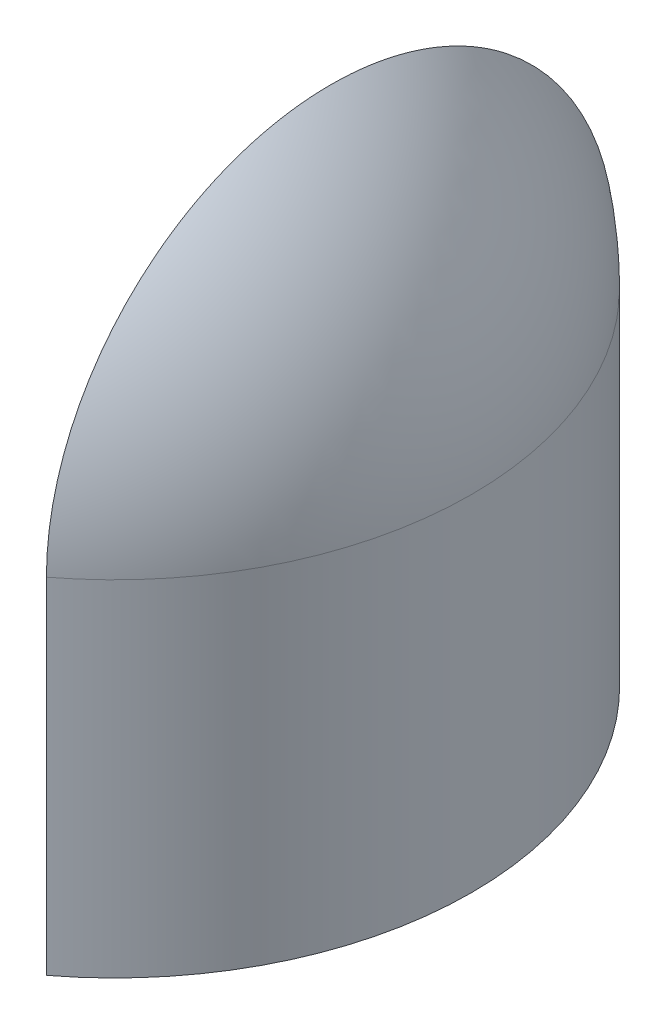
ISO-10303-21;
HEADER;
FILE_DESCRIPTION(('STEP AP214'),'2;1');
FILE_NAME('part.step','',(''),(''),'','','');
FILE_SCHEMA(('AUTOMOTIVE_DESIGN { 1 0 10303 214 1 1 1 1 }'));
ENDSEC;
DATA;
#1=APPLICATION_CONTEXT('core data for automotive mechanical design processes');
#2=APPLICATION_PROTOCOL_DEFINITION('international standard','automotive_design',2000,#1);
#3=PRODUCT_CONTEXT('',#1,'mechanical');
#4=PRODUCT('Part','Part','',(#3));
#5=PRODUCT_RELATED_PRODUCT_CATEGORY('part','',(#4));
#6=PRODUCT_DEFINITION_FORMATION('','',#4);
#7=PRODUCT_DEFINITION_CONTEXT('part definition',#1,'design');
#8=PRODUCT_DEFINITION('design','',#6,#7);
#9=PRODUCT_DEFINITION_SHAPE('','',#8);
#10=(LENGTH_UNIT() NAMED_UNIT(*) SI_UNIT(.MILLI.,.METRE.));
#11=(NAMED_UNIT(*) PLANE_ANGLE_UNIT() SI_UNIT($,.RADIAN.));
#12=(NAMED_UNIT(*) SI_UNIT($,.STERADIAN.) SOLID_ANGLE_UNIT());
#13=UNCERTAINTY_MEASURE_WITH_UNIT(LENGTH_MEASURE(1.E-05),#10,'distance_accuracy_value','');
#14=(GEOMETRIC_REPRESENTATION_CONTEXT(3) GLOBAL_UNCERTAINTY_ASSIGNED_CONTEXT((#13)) GLOBAL_UNIT_ASSIGNED_CONTEXT((#10,
#11,#12)) REPRESENTATION_CONTEXT('',''));
#15=CARTESIAN_POINT('',(0.,0.,0.));
#16=DIRECTION('',(0.,0.,1.));
#17=DIRECTION('',(1.,0.,0.));
#18=AXIS2_PLACEMENT_3D('',#15,#16,#17);
#19=CARTESIAN_POINT('',(57.499999999999,205.000000000001,0.));
#20=DIRECTION('',(-1.,0.,0.));
#21=DIRECTION('',(0.,0.,1.));
#22=AXIS2_PLACEMENT_3D('',#19,#20,#21);
#23=PLANE('',#22);
#24=CARTESIAN_POINT('',(57.499999999999,106.722527892982,0.));
#25=DIRECTION('',(-1.,0.,0.));
#26=DIRECTION('',(0.,0.,1.));
#27=AXIS2_PLACEMENT_3D('',#24,#25,#26);
#28=CIRCLE('',#27,75.6224173112716);
#29=CARTESIAN_POINT('',(57.499999999999,106.722527892982,75.6224173112716));
#30=VERTEX_POINT('',#29);
#31=CARTESIAN_POINT('',(57.499999999999,106.722527892982,-75.6224173112716));
#32=VERTEX_POINT('',#31);
#33=EDGE_CURVE('E283',#30,#32,#28,.T.);
#34=ORIENTED_EDGE('',*,*,#33,.T.);
#35=DIRECTION('',(0.,-1.,0.));
#36=VECTOR('',#35,1.);
#37=CARTESIAN_POINT('',(57.499999999999,25.,-75.6224173112716));
#38=LINE('',#37,#36);
#39=CARTESIAN_POINT('',(57.499999999999,15.0000000000009,-75.6224173112716));
#40=VERTEX_POINT('',#39);
#41=EDGE_CURVE('E289',#32,#40,#38,.T.);
#42=ORIENTED_EDGE('',*,*,#41,.T.);
#43=DIRECTION('',(0.,0.,1.));
#44=VECTOR('',#43,1.);
#45=CARTESIAN_POINT('',(57.499999999999,15.0000000000009,0.));
#46=LINE('',#45,#44);
#47=CARTESIAN_POINT('',(57.499999999999,15.0000000000009,-52.4285992260178));
#48=VERTEX_POINT('',#47);
#49=EDGE_CURVE('E44',#40,#48,#46,.T.);
#50=ORIENTED_EDGE('',*,*,#49,.T.);
#51=DIRECTION('',(0.,-1.,0.));
#52=VECTOR('',#51,1.);
#53=CARTESIAN_POINT('',(57.499999999999,207.501000000001,-52.4285992260178));
#54=LINE('',#53,#52);
#55=CARTESIAN_POINT('',(57.499999999999,45.2098005422494,-52.4285992260178));
#56=VERTEX_POINT('',#55);
#57=EDGE_CURVE('E371',#48,#56,#54,.F.);
#58=ORIENTED_EDGE('',*,*,#57,.T.);
#59=DIRECTION('',(0.,0.,1.));
#60=VECTOR('',#59,1.);
#61=CARTESIAN_POINT('',(57.499999999999,45.2098005422494,-95.));
#62=LINE('',#61,#60);
#63=CARTESIAN_POINT('',(57.4999999999997,45.2098005422512,-49.548037466709));
#64=VERTEX_POINT('',#63);
#65=EDGE_CURVE('E184',#64,#56,#62,.F.);
#66=ORIENTED_EDGE('',*,*,#65,.F.);
#67=DIRECTION('',(0.,1.,0.));
#68=VECTOR('',#67,1.);
#69=CARTESIAN_POINT('',(57.4999999999997,40.927673459077,-49.548037466709));
#70=LINE('',#69,#68);
#71=CARTESIAN_POINT('',(57.499999999999,140.927673459077,-49.548037466709));
#72=VERTEX_POINT('',#71);
#73=EDGE_CURVE('E178',#64,#72,#70,.T.);
#74=ORIENTED_EDGE('',*,*,#73,.T.);
#75=CARTESIAN_POINT('',(57.4999999999993,106.722527892983,0.));
#76=DIRECTION('',(1.,0.,0.));
#77=DIRECTION('',(0.,1.,0.));
#78=AXIS2_PLACEMENT_3D('',#75,#76,#77);
#79=CIRCLE('',#78,60.2079728939622);
#80=CARTESIAN_POINT('',(57.499999999999,140.927673459076,49.5480374667095));
#81=VERTEX_POINT('',#80);
#82=EDGE_CURVE('E39',#72,#81,#79,.T.);
#83=ORIENTED_EDGE('',*,*,#82,.T.);
#84=DIRECTION('',(0.,-1.,0.));
#85=VECTOR('',#84,1.);
#86=CARTESIAN_POINT('',(57.499999999999,140.927673459076,49.5480374667095));
#87=LINE('',#86,#85);
#88=CARTESIAN_POINT('',(57.4999999999997,45.2098005422512,49.5480374667095));
#89=VERTEX_POINT('',#88);
#90=EDGE_CURVE('E171',#81,#89,#87,.T.);
#91=ORIENTED_EDGE('',*,*,#90,.T.);
#92=DIRECTION('',(0.,0.,1.));
#93=VECTOR('',#92,1.);
#94=CARTESIAN_POINT('',(57.499999999999,45.2098005422494,-95.));
#95=LINE('',#94,#93);
#96=CARTESIAN_POINT('',(57.4999999999992,45.2098005422493,52.4285992260176));
#97=VERTEX_POINT('',#96);
#98=EDGE_CURVE('E304',#97,#89,#95,.F.);
#99=ORIENTED_EDGE('',*,*,#98,.F.);
#100=DIRECTION('',(0.,-1.,0.));
#101=VECTOR('',#100,1.);
#102=CARTESIAN_POINT('',(57.499999999999,207.501000000001,52.4285992260178));
#103=LINE('',#102,#101);
#104=CARTESIAN_POINT('',(57.499999999999,15.0000000000009,52.4285992260178));
#105=VERTEX_POINT('',#104);
#106=EDGE_CURVE('E373',#97,#105,#103,.T.);
#107=ORIENTED_EDGE('',*,*,#106,.T.);
#108=CARTESIAN_POINT('',(57.499999999999,15.0000000000009,75.6224173112716));
#109=VERTEX_POINT('',#108);
#110=EDGE_CURVE('E11',#105,#109,#46,.T.);
#111=ORIENTED_EDGE('',*,*,#110,.T.);
#112=DIRECTION('',(0.,-1.,0.));
#113=VECTOR('',#112,1.);
#114=CARTESIAN_POINT('',(57.499999999999,25.,75.6224173112716));
#115=LINE('',#114,#113);
#116=EDGE_CURVE('E189',#109,#30,#115,.F.);
#117=ORIENTED_EDGE('',*,*,#116,.T.);
#118=EDGE_LOOP('',(#34,#42,#50,#58,#66,#74,#83,#91,#99,#107,#111,#117));
#119=FACE_BOUND('',#118,.T.);
#120=ADVANCED_FACE('F34',(#119),#23,.T.);
#121=CARTESIAN_POINT('',(57.499999999999,15.0000000000009,0.));
#122=DIRECTION('',(0.,-1.,0.));
#123=DIRECTION('',(1.,0.,0.));
#124=AXIS2_PLACEMENT_3D('',#121,#122,#123);
#125=PLANE('',#124);
#126=ORIENTED_EDGE('',*,*,#110,.F.);
#127=CARTESIAN_POINT('',(0.,15.0000000000009,0.));
#128=DIRECTION('',(0.,-1.,0.));
#129=DIRECTION('',(1.,0.,0.));
#130=AXIS2_PLACEMENT_3D('',#127,#128,#129);
#131=CIRCLE('',#130,77.8139320225002);
#132=EDGE_CURVE('E288',#105,#48,#131,.F.);
#133=ORIENTED_EDGE('',*,*,#132,.T.);
#134=ORIENTED_EDGE('',*,*,#49,.F.);
#135=CARTESIAN_POINT('',(0.,15.0000000000009,0.));
#136=DIRECTION('',(0.,-1.,0.));
#137=DIRECTION('',(1.,0.,0.));
#138=AXIS2_PLACEMENT_3D('',#135,#136,#137);
#139=CIRCLE('',#138,95.);
#140=EDGE_CURVE('E186',#40,#109,#139,.T.);
#141=ORIENTED_EDGE('',*,*,#140,.T.);
#142=EDGE_LOOP('',(#126,#133,#134,#141));
#143=FACE_BOUND('',#142,.T.);
#144=ADVANCED_FACE('F250',(#143),#125,.T.);
#145=CARTESIAN_POINT('',(76.499999999999,147.111263946491,0.));
#146=DIRECTION('',(-1.,0.,0.));
#147=DIRECTION('',(0.,-1.,0.));
#148=AXIS2_PLACEMENT_3D('',#145,#146,#147);
#149=CYLINDRICAL_SURFACE('',#148,13.);
#150=DIRECTION('',(-1.,0.,0.));
#151=VECTOR('',#150,1.);
#152=CARTESIAN_POINT('',(76.499999999999,150.364833675964,-12.5862736350144));
#153=LINE('',#152,#151);
#154=CARTESIAN_POINT('',(76.499999999999,150.364833675964,-12.5862736350144));
#155=VERTEX_POINT('',#154);
#156=CARTESIAN_POINT('',(71.8466064746921,150.364833675964,-12.5862736350144));
#157=VERTEX_POINT('',#156);
#158=EDGE_CURVE('E351',#155,#157,#153,.T.);
#159=ORIENTED_EDGE('',*,*,#158,.F.);
#160=CARTESIAN_POINT('',(76.499999999999,147.111263946491,0.));
#161=DIRECTION('',(1.,0.,0.));
#162=DIRECTION('',(0.,1.,0.));
#163=AXIS2_PLACEMENT_3D('',#160,#161,#162);
#164=CIRCLE('',#163,13.);
#165=CARTESIAN_POINT('',(76.4999999999989,154.770031568916,10.5044408944835));
#166=VERTEX_POINT('',#165);
#167=EDGE_CURVE('E361',#155,#166,#164,.T.);
#168=ORIENTED_EDGE('',*,*,#167,.T.);
#169=DIRECTION('',(-1.,0.,0.));
#170=VECTOR('',#169,1.);
#171=CARTESIAN_POINT('',(76.4999999999989,154.770031568916,10.5044408944835));
#172=LINE('',#171,#170);
#173=CARTESIAN_POINT('',(69.3259988172218,154.770031568916,10.5044408944835));
#174=VERTEX_POINT('',#173);
#175=EDGE_CURVE('E354',#166,#174,#172,.T.);
#176=ORIENTED_EDGE('',*,*,#175,.T.);
#177=CARTESIAN_POINT('',(71.8467189050669,150.364633675964,-12.5863253336051));
#178=CARTESIAN_POINT('',(71.6328419163096,150.7451116213,-12.4879762810928));
#179=CARTESIAN_POINT('',(71.4201383773197,151.121770690636,-12.3722097157349));
#180=CARTESIAN_POINT('',(70.9985383745758,151.865085145619,-12.1060777194812));
#181=CARTESIAN_POINT('',(70.7896436054353,152.231736112823,-11.9556972747903));
#182=CARTESIAN_POINT('',(70.3759964601069,152.954628733967,-11.619592436234));
#183=CARTESIAN_POINT('',(70.1712789526628,153.310789191055,-11.4336489768622));
#184=CARTESIAN_POINT('',(69.869781771233,153.833109747973,-11.1291248160588));
#185=CARTESIAN_POINT('',(69.7702149064225,154.005225879106,-11.0233514786614));
#186=CARTESIAN_POINT('',(69.5731198858458,154.345220290091,-10.8032819124021));
#187=CARTESIAN_POINT('',(69.4755924182017,154.513097143391,-10.6889828644099));
#188=CARTESIAN_POINT('',(69.1859032603954,155.01072015572,-10.332730020338));
#189=CARTESIAN_POINT('',(68.9972034551853,155.333474165346,-10.0779926392922));
#190=CARTESIAN_POINT('',(68.6313101474404,155.956883232759,-9.53550261194367));
#191=CARTESIAN_POINT('',(68.4541154267531,156.257540630568,-9.24775346986488));
#192=CARTESIAN_POINT('',(68.1138197966279,156.832865827522,-8.64087866809644));
#193=CARTESIAN_POINT('',(67.9506901901449,157.107586659378,-8.32181987880415));
#194=CARTESIAN_POINT('',(67.7182319647807,157.497787091426,-7.82080457849305));
#195=CARTESIAN_POINT('',(67.6427879393398,157.624202626085,-7.65006867404525));
#196=CARTESIAN_POINT('',(67.4962355027534,157.869381747624,-7.30125756138245));
#197=CARTESIAN_POINT('',(67.4251290612779,157.988141859592,-7.1231790795622));
#198=CARTESIAN_POINT('',(67.2338480513691,158.307141438812,-6.61805846081697));
#199=CARTESIAN_POINT('',(67.1187674870859,158.498503330339,-6.28338845464036));
#200=CARTESIAN_POINT('',(66.9054262787973,158.85247478541,-5.59410245580553));
#201=CARTESIAN_POINT('',(66.8071617059502,159.015091065294,-5.2394911479722));
#202=CARTESIAN_POINT('',(66.6737464426229,159.235479818073,-4.69486615746536));
#203=CARTESIAN_POINT('',(66.6316096178607,159.305012459391,-4.51123169651767));
#204=CARTESIAN_POINT('',(66.5521890548256,159.435958929011,-4.14012244937118));
#205=CARTESIAN_POINT('',(66.5149040298708,159.497374909892,-3.9526486966669));
#206=CARTESIAN_POINT('',(66.4106170103248,159.669032721525,-3.38504336400061));
#207=CARTESIAN_POINT('',(66.3511495075768,159.766739799955,-2.99959132261416));
#208=CARTESIAN_POINT('',(66.2610488491341,159.914649320854,-2.27771331082883));
#209=CARTESIAN_POINT('',(66.2274211869947,159.969791250591,-1.94265111032112));
#210=CARTESIAN_POINT('',(66.1762081113399,160.053735608466,-1.26802675724969));
#211=CARTESIAN_POINT('',(66.1586207817907,160.08254118251,-0.928465147062252));
#212=CARTESIAN_POINT('',(66.1398012495565,160.113364055437,-0.247829585529989));
#213=CARTESIAN_POINT('',(66.1385620533854,160.115392809041,0.0932436566931948));
#214=CARTESIAN_POINT('',(66.1524415817188,160.092662036855,0.774159929029779));
#215=CARTESIAN_POINT('',(66.1675598210805,160.067903305551,1.11400299532885));
#216=CARTESIAN_POINT('',(66.2120434067109,159.995001523201,1.76273885486179));
#217=CARTESIAN_POINT('',(66.2401813651404,159.948872680824,2.07194542141671));
#218=CARTESIAN_POINT('',(66.3096812449334,159.83482848447,2.6847783401923));
#219=CARTESIAN_POINT('',(66.3510422463473,159.76691464611,2.98840507905747));
#220=CARTESIAN_POINT('',(66.4464094890974,159.61013162045,3.58808375569735));
#221=CARTESIAN_POINT('',(66.5004130837375,159.521266819155,3.88413726453932));
#222=CARTESIAN_POINT('',(66.6203715478334,159.323575905673,4.46700710747468));
#223=CARTESIAN_POINT('',(66.6863268482168,159.214749073737,4.75382310806359));
#224=CARTESIAN_POINT('',(66.831676917007,158.9745023037,5.32567391621218));
#225=CARTESIAN_POINT('',(66.9114331547172,158.842472614176,5.61036032599005));
#226=CARTESIAN_POINT('',(67.081917985275,158.559673015076,6.16696201913095));
#227=CARTESIAN_POINT('',(67.1726505803371,158.408896269362,6.43887259367443));
#228=CARTESIAN_POINT('',(67.3641641236419,158.089925963085,6.9688382683625));
#229=CARTESIAN_POINT('',(67.4649522142033,157.921720019416,7.22688331690237));
#230=CARTESIAN_POINT('',(67.6755876240161,157.56932744104,7.7280515014346));
#231=CARTESIAN_POINT('',(67.7854380073865,157.385135400049,7.97116954148056));
#232=CARTESIAN_POINT('',(68.0061940673468,157.014012426394,8.42713390512714));
#233=CARTESIAN_POINT('',(68.1166178173918,156.827949288188,8.64092244235938));
#234=CARTESIAN_POINT('',(68.3438270467667,156.44411622465,9.05413665530733));
#235=CARTESIAN_POINT('',(68.4606128181497,156.246345761847,9.2535616706781));
#236=CARTESIAN_POINT('',(68.6994078582807,155.840870472189,9.6369891785877));
#237=CARTESIAN_POINT('',(68.8213979958806,155.633201748159,9.82104185193251));
#238=CARTESIAN_POINT('',(69.0702703790164,155.208364366268,10.1741467840018));
#239=CARTESIAN_POINT('',(69.1971513879316,154.991198107945,10.3432027992929));
#240=CARTESIAN_POINT('',(69.3261586329737,154.769757249874,10.5046408944831));
#241=B_SPLINE_CURVE_WITH_KNOTS('',3,(#177,#178,#179,#180,#181,#182,#183,#184,#185,#186,#187,
#188,#189,#190,#191,#192,#193,#194,#195,#196,#197,#198,#199,#200,#201,#202,#203,#204,#205,#206,
#207,#208,#209,#210,#211,#212,#213,#214,#215,#216,#217,#218,#219,#220,#221,#222,#223,#224,#225,
#226,#227,#228,#229,#230,#231,#232,#233,#234,#235,#236,#237,#238,#239,#240),.UNSPECIFIED.,.F.,
.F.,(4,2,2,2,2,2,2,2,2,2,2,2,2,2,2,2,2,2,2,2,2,2,2,2,2,2,2,2,2,2,2,4),(0.,1.34190340274917,
2.68438995758226,4.03542921692799,4.71091605575903,5.3866272512467,6.7418550936305,
8.09693921040529,9.44918968079764,10.1252625379055,10.801640144585,12.0067488816307,
13.2115756748556,13.8138292778584,14.4159228381975,15.6196591327966,16.6420247466658,
17.6642682219474,18.6860743826282,19.7078502385389,20.648444511699,21.5889733603635,
22.5293054873967,23.4696715255483,24.4400216984434,25.4107267542389,26.3821262684639,
27.353855586643,28.2657206100768,29.1776275286403,30.0864307492203,30.9950056737624),.UNSPECIFIED.);
#242=EDGE_CURVE('E255',#157,#174,#241,.T.);
#243=ORIENTED_EDGE('',*,*,#242,.F.);
#244=EDGE_LOOP('',(#159,#168,#176,#243));
#245=FACE_BOUND('',#244,.T.);
#246=ADVANCED_FACE('F245',(#245),#149,.F.);
#247=CARTESIAN_POINT('',(76.4999999999999,12.4682327961274,-48.2327421157007));
#248=DIRECTION('',(0.,0.250274594574833,-0.968174895001106));
#249=DIRECTION('',(0.,0.968174895001106,0.250274594574833));
#250=AXIS2_PLACEMENT_3D('',#247,#248,#249);
#251=PLANE('',#250);
#252=DIRECTION('',(-1.,0.,0.));
#253=VECTOR('',#252,1.);
#254=CARTESIAN_POINT('',(76.4999999999996,53.6535697294732,-37.5862736350144));
#255=LINE('',#254,#253);
#256=CARTESIAN_POINT('',(76.4999999999996,53.6535697294732,-37.5862736350144));
#257=VERTEX_POINT('',#256);
#258=CARTESIAN_POINT('',(68.1342795590891,53.6535697294732,-37.5862736350144));
#259=VERTEX_POINT('',#258);
#260=EDGE_CURVE('E348',#257,#259,#255,.T.);
#261=ORIENTED_EDGE('',*,*,#260,.F.);
#262=DIRECTION('',(0.,-0.968174895001106,-0.250274594574833));
#263=VECTOR('',#262,1.);
#264=CARTESIAN_POINT('',(76.4999999999999,12.4682327961274,-48.2327421157007));
#265=LINE('',#264,#263);
#266=EDGE_CURVE('E363',#155,#257,#265,.T.);
#267=ORIENTED_EDGE('',*,*,#266,.F.);
#268=ORIENTED_EDGE('',*,*,#158,.T.);
#269=CARTESIAN_POINT('',(0.,112.505941935101,-22.3728512775654));
#270=DIRECTION('',(0.,0.250274594574833,-0.968174895001106));
#271=DIRECTION('',(0.,0.968174895001106,0.250274594574833));
#272=AXIS2_PLACEMENT_3D('',#269,#270,#271);
#273=CIRCLE('',#272,81.7985797415174);
#274=CARTESIAN_POINT('',(76.349417549936,140.927673459077,-15.0257930435573));
#275=VERTEX_POINT('',#274);
#276=EDGE_CURVE('E264',#157,#275,#273,.T.);
#277=ORIENTED_EDGE('',*,*,#276,.T.);
#278=CARTESIAN_POINT('',(0.,199.054210940709,0.));
#279=DIRECTION('',(0.,0.250274594574833,-0.968174895001106));
#280=DIRECTION('',(0.,-0.968174895001106,-0.250274594574833));
#281=AXIS2_PLACEMENT_3D('',#278,#279,#280);
#282=ELLIPSE('',#281,310.914226650494,77.8139320225002);
#283=EDGE_CURVE('E232',#259,#275,#282,.F.);
#284=ORIENTED_EDGE('',*,*,#283,.F.);
#285=EDGE_LOOP('',(#261,#267,#268,#277,#284));
#286=FACE_BOUND('',#285,.T.);
#287=ADVANCED_FACE('F241',(#286),#251,.F.);
#288=CARTESIAN_POINT('',(76.4999999999996,50.4000000000004,-25.));
#289=DIRECTION('',(-1.,0.,0.));
#290=DIRECTION('',(0.,-1.,0.));
#291=AXIS2_PLACEMENT_3D('',#288,#289,#290);
#292=CYLINDRICAL_SURFACE('',#291,13.);
#293=CARTESIAN_POINT('',(68.1342795590891,53.6535697294732,-37.5862736350144));
#294=CARTESIAN_POINT('',(68.1121382608706,53.4983096421865,-37.626409056009));
#295=CARTESIAN_POINT('',(68.0915111559926,53.3421209990942,-37.6637181022397));
#296=CARTESIAN_POINT('',(68.0533687001341,53.0281009758368,-37.7325931879928));
#297=CARTESIAN_POINT('',(68.035853453362,52.8702695408459,-37.7641590351904));
#298=CARTESIAN_POINT('',(67.9881071899536,52.3946936951342,-37.8500944340545));
#299=CARTESIAN_POINT('',(67.9626692666225,52.0748231910066,-37.8957133796814));
#300=CARTESIAN_POINT('',(67.9251393320425,51.4325668667435,-37.962941640616));
#301=CARTESIAN_POINT('',(67.9130170333365,51.1101884416445,-37.9846054445689));
#302=CARTESIAN_POINT('',(67.9022493683705,50.4645005293209,-38.0038507812545));
#303=CARTESIAN_POINT('',(67.9036029779021,50.1411911147215,-38.001434144171));
#304=CARTESIAN_POINT('',(67.9197684084975,49.495635113046,-37.9725341109711));
#305=CARTESIAN_POINT('',(67.9345950993828,49.1733900951831,-37.9460241237676));
#306=CARTESIAN_POINT('',(67.9774334953479,48.5326278236873,-37.8692286327333));
#307=CARTESIAN_POINT('',(68.0054456535011,48.2141106985361,-37.8189423119099));
#308=CARTESIAN_POINT('',(68.0741134017778,47.583035414879,-37.6951999035187));
#309=CARTESIAN_POINT('',(68.1147679664181,47.2704767752348,-37.6217456951968));
#310=CARTESIAN_POINT('',(68.2079756820556,46.6532998126522,-37.4524951026183));
#311=CARTESIAN_POINT('',(68.2605288678598,46.3486815129446,-37.356698653004));
#312=CARTESIAN_POINT('',(68.3771585483768,45.746443128042,-37.1427942695924));
#313=CARTESIAN_POINT('',(68.4413355544865,45.4489119534828,-37.0244912318278));
#314=CARTESIAN_POINT('',(68.5798435474539,44.8653529519942,-36.7673006201443));
#315=CARTESIAN_POINT('',(68.6541745704576,44.5793251660188,-36.6284129729487));
#316=CARTESIAN_POINT('',(68.8119079635558,44.0200519773203,-36.3312212128367));
#317=CARTESIAN_POINT('',(68.8953130162218,43.7468103889324,-36.1729113563228));
#318=CARTESIAN_POINT('',(69.0700748863792,43.2142599318851,-35.8380864710758));
#319=CARTESIAN_POINT('',(69.1614346885182,42.9549563523427,-35.6615646045045));
#320=CARTESIAN_POINT('',(69.3602212277228,42.4267421125553,-35.2734994917144));
#321=CARTESIAN_POINT('',(69.4683456101588,42.1593688502015,-35.0602195978339));
#322=CARTESIAN_POINT('',(69.6913731728529,41.6437306612327,-34.6147740186044));
#323=CARTESIAN_POINT('',(69.8062787350279,41.3954725203021,-34.3826016862303));
#324=CARTESIAN_POINT('',(70.0414587441208,40.9190732883773,-33.9009423723291));
#325=CARTESIAN_POINT('',(70.1617337340178,40.6909342388822,-33.6514536382735));
#326=CARTESIAN_POINT('',(70.4063242010827,40.2556282499446,-33.1366677274751));
#327=CARTESIAN_POINT('',(70.5306398498293,40.0484622026209,-32.8713698790294));
#328=CARTESIAN_POINT('',(70.7960092296018,39.6340952740546,-32.2961943199499));
#329=CARTESIAN_POINT('',(70.9373911443288,39.4294347583854,-31.9846344125119));
#330=CARTESIAN_POINT('',(71.2219695225043,39.0479621398114,-31.3458340999745));
#331=CARTESIAN_POINT('',(71.3651655385114,38.871143308978,-31.0185975081431));
#332=CARTESIAN_POINT('',(71.6520311005697,38.5460988200958,-30.3500714749018));
#333=CARTESIAN_POINT('',(71.7957009178034,38.3978943280286,-30.0087718558053));
#334=CARTESIAN_POINT('',(72.0819686627791,38.1311978481853,-29.3144804428005));
#335=CARTESIAN_POINT('',(72.2245669472938,38.0126955032385,-28.9614927732714));
#336=CARTESIAN_POINT('',(72.5147044814737,37.8009203897835,-28.2274550813606));
#337=CARTESIAN_POINT('',(72.6621229644457,37.7092497565108,-27.8458935450069));
#338=CARTESIAN_POINT('',(72.95303412061,37.5605922186704,-27.0745770857503));
#339=CARTESIAN_POINT('',(73.0965266157649,37.5036068845453,-26.6848217926861));
#340=CARTESIAN_POINT('',(73.378305029844,37.4251914451058,-25.8999265818033));
#341=CARTESIAN_POINT('',(73.5165915691491,37.4037570900771,-25.5047873132719));
#342=CARTESIAN_POINT('',(73.7868408761471,37.3971471349106,-24.7120510683469));
#343=CARTESIAN_POINT('',(73.9188039581324,37.4119697307972,-24.314454215213));
#344=CARTESIAN_POINT('',(74.1721081150061,37.4775164569258,-23.5302314233855));
#345=CARTESIAN_POINT('',(74.2936355396714,37.5273030946547,-23.1435874477237));
#346=CARTESIAN_POINT('',(74.5289977907715,37.6619866301936,-22.374056118271));
#347=CARTESIAN_POINT('',(74.6428323940857,37.746884545854,-21.9911688737142));
#348=CARTESIAN_POINT('',(74.86211333156,37.9516391132147,-21.2327049788089));
#349=CARTESIAN_POINT('',(74.9675654511265,38.0714713826442,-20.8571234238574));
#350=CARTESIAN_POINT('',(75.1697131734078,38.3456919604172,-20.1164001547908));
#351=CARTESIAN_POINT('',(75.2664104588898,38.5000736081322,-19.7512564436891));
#352=CARTESIAN_POINT('',(75.4298655202259,38.8037067499812,-19.1161006097459));
#353=CARTESIAN_POINT('',(75.4984399814246,38.9461822405135,-18.8432932569585));
#354=CARTESIAN_POINT('',(75.6301404219152,39.2507458674163,-18.3075378574467));
#355=CARTESIAN_POINT('',(75.6932674898139,39.4128300695595,-18.0445878467998));
#356=CARTESIAN_POINT('',(75.8141134658043,39.7560542443258,-17.5299196431522));
#357=CARTESIAN_POINT('',(75.871829460689,39.9372043715074,-17.2782075381648));
#358=CARTESIAN_POINT('',(75.9818973879029,40.3177039192582,-16.7875774899383));
#359=CARTESIAN_POINT('',(76.034247740666,40.5170586665269,-16.5486633240492));
#360=CARTESIAN_POINT('',(76.0839394895728,40.7250697068438,-16.316928894535));
#361=B_SPLINE_CURVE_WITH_KNOTS('',3,(#293,#294,#295,#296,#297,#298,#299,#300,#301,#302,#303,
#304,#305,#306,#307,#308,#309,#310,#311,#312,#313,#314,#315,#316,#317,#318,#319,#320,#321,#322,
#323,#324,#325,#326,#327,#328,#329,#330,#331,#332,#333,#334,#335,#336,#337,#338,#339,#340,#341,
#342,#343,#344,#345,#346,#347,#348,#349,#350,#351,#352,#353,#354,#355,#356,#357,#358,#359,#360),
.UNSPECIFIED.,.F.,.F.,(4,2,2,2,2,2,2,2,2,2,2,2,2,2,2,2,2,2,2,2,2,2,2,2,2,2,2,2,2,2,2,2,2,4),(0.,
0.485584890665824,0.971186039303997,1.94224938880291,2.91109937342312,3.87987572317819,
4.84972258164123,5.8196027680114,6.78940430349627,7.75920867597435,8.73783837976346,
9.7164715673444,10.6953948602202,11.6746870441976,12.7496771027017,13.8250470295931,
14.9005259498106,15.9760505979659,17.1707649964534,18.3651902482937,19.560495657863,
20.7553836814597,22.0114414694366,23.2675561235784,24.5235206127099,25.7794226122201,
27.0028755382437,28.2263639337642,29.4490004372819,30.671401436617,31.6165919873301,
32.5615932116636,33.5071003176302,34.4528849723395),.UNSPECIFIED.);
#362=CARTESIAN_POINT('',(76.0839394895728,40.7250697068438,-16.316928894535));
#363=VERTEX_POINT('',#362);
#364=EDGE_CURVE('E225',#259,#363,#361,.T.);
#365=ORIENTED_EDGE('',*,*,#364,.T.);
#366=DIRECTION('',(-1.,0.,0.));
#367=VECTOR('',#366,1.);
#368=CARTESIAN_POINT('',(76.4999999999997,40.7250697068438,-16.316928894535));
#369=LINE('',#368,#367);
#370=CARTESIAN_POINT('',(76.4999999999997,40.7250697068438,-16.316928894535));
#371=VERTEX_POINT('',#370);
#372=EDGE_CURVE('E337',#371,#363,#369,.T.);
#373=ORIENTED_EDGE('',*,*,#372,.F.);
#374=CARTESIAN_POINT('',(76.4999999999996,50.4000000000004,-25.));
#375=DIRECTION('',(1.,0.,0.));
#376=DIRECTION('',(0.,1.,0.));
#377=AXIS2_PLACEMENT_3D('',#374,#375,#376);
#378=CIRCLE('',#377,13.);
#379=EDGE_CURVE('E366',#371,#257,#378,.T.);
#380=ORIENTED_EDGE('',*,*,#379,.T.);
#381=ORIENTED_EDGE('',*,*,#260,.T.);
#382=EDGE_LOOP('',(#365,#373,#380,#381));
#383=FACE_BOUND('',#382,.T.);
#384=ADVANCED_FACE('F235',(#383),#292,.F.);
#385=CARTESIAN_POINT('',(76.4999999999998,30.6674259863725,-27.5234479621632));
#386=DIRECTION('',(0.,0.744225407165893,-0.667928546574228));
#387=DIRECTION('',(0.,0.667928546574228,0.744225407165893));
#388=AXIS2_PLACEMENT_3D('',#385,#386,#387);
#389=PLANE('',#388);
#390=CARTESIAN_POINT('',(0.,55.3692117854978,0.));
#391=DIRECTION('',(0.,0.744225407165893,-0.667928546574228));
#392=DIRECTION('',(0.,-0.667928546574228,-0.744225407165893));
#393=AXIS2_PLACEMENT_3D('',#390,#391,#392);
#394=ELLIPSE('',#393,104.556941046699,77.8139320225002);
#395=CARTESIAN_POINT('',(76.4999999999991,42.5896921336752,-14.2393123711259));
#396=VERTEX_POINT('',#395);
#397=EDGE_CURVE('E325',#363,#396,#394,.F.);
#398=ORIENTED_EDGE('',*,*,#397,.T.);
#399=DIRECTION('',(0.,-0.667928546574228,-0.744225407165893));
#400=VECTOR('',#399,1.);
#401=CARTESIAN_POINT('',(76.4999999999998,30.6674259863725,-27.5234479621632));
#402=LINE('',#401,#400);
#403=EDGE_CURVE('E60',#396,#371,#402,.T.);
#404=ORIENTED_EDGE('',*,*,#403,.T.);
#405=ORIENTED_EDGE('',*,*,#372,.T.);
#406=EDGE_LOOP('',(#398,#404,#405));
#407=FACE_BOUND('',#406,.T.);
#408=ADVANCED_FACE('F240',(#407),#389,.T.);
#409=CARTESIAN_POINT('',(0.,106.722527892982,0.));
#410=DIRECTION('',(0.,-1.,0.));
#411=DIRECTION('',(-1.,0.,0.));
#412=AXIS2_PLACEMENT_3D('',#409,#410,#411);
#413=SPHERICAL_SURFACE('',#412,85.);
#414=CARTESIAN_POINT('',(76.4999999999992,106.722527892983,0.));
#415=DIRECTION('',(1.,0.,0.));
#416=DIRECTION('',(0.,1.,0.));
#417=AXIS2_PLACEMENT_3D('',#414,#415,#416);
#418=CIRCLE('',#417,37.0506410200973);
#419=CARTESIAN_POINT('',(76.499999999999,140.927673459077,-14.2393123711235));
#420=VERTEX_POINT('',#419);
#421=CARTESIAN_POINT('',(76.499999999999,140.927673459077,14.2393123711235));
#422=VERTEX_POINT('',#421);
#423=EDGE_CURVE('E297',#420,#422,#418,.T.);
#424=ORIENTED_EDGE('',*,*,#423,.F.);
#425=CARTESIAN_POINT('',(0.,140.927673459077,0.));
#426=DIRECTION('',(0.,-1.,0.));
#427=DIRECTION('',(0.,0.,-1.));
#428=AXIS2_PLACEMENT_3D('',#425,#426,#427);
#429=CIRCLE('',#428,77.8139320225002);
#430=EDGE_CURVE('E309',#422,#420,#429,.F.);
#431=ORIENTED_EDGE('',*,*,#430,.F.);
#432=EDGE_LOOP('',(#424,#431));
#433=FACE_BOUND('',#432,.T.);
#434=ADVANCED_FACE('F266',(#433),#413,.F.);
#435=CARTESIAN_POINT('',(76.5,5.16026158009459E-13,0.));
#436=DIRECTION('',(1.,0.,0.));
#437=DIRECTION('',(0.,1.,0.));
#438=AXIS2_PLACEMENT_3D('',#435,#436,#437);
#439=PLANE('',#438);
#440=CARTESIAN_POINT('',(76.4999999999993,92.5400697068438,41.4168506692873));
#441=VERTEX_POINT('',#440);
#442=CARTESIAN_POINT('',(76.499999999999,68.1487314373214,14.2393123711259));
#443=VERTEX_POINT('',#442);
#444=EDGE_CURVE('E52',#441,#443,#402,.T.);
#445=ORIENTED_EDGE('',*,*,#444,.F.);
#446=CARTESIAN_POINT('',(76.4999999999993,102.215,32.7337795638224));
#447=DIRECTION('',(1.,0.,0.));
#448=DIRECTION('',(0.,1.,0.));
#449=AXIS2_PLACEMENT_3D('',#446,#447,#448);
#450=CIRCLE('',#449,13.);
#451=CARTESIAN_POINT('',(76.4999999999992,109.873767622425,43.2382204583059));
#452=VERTEX_POINT('',#451);
#453=EDGE_CURVE('E336',#452,#441,#450,.T.);
#454=ORIENTED_EDGE('',*,*,#453,.F.);
#455=DIRECTION('',(0.,0.808033914960269,-0.589135970955756));
#456=VECTOR('',#455,1.);
#457=CARTESIAN_POINT('',(76.4999999999996,58.7183205099058,80.535558411988));
#458=LINE('',#457,#456);
#459=EDGE_CURVE('E358',#452,#166,#458,.T.);
#460=ORIENTED_EDGE('',*,*,#459,.T.);
#461=ORIENTED_EDGE('',*,*,#167,.F.);
#462=ORIENTED_EDGE('',*,*,#266,.T.);
#463=ORIENTED_EDGE('',*,*,#379,.F.);
#464=ORIENTED_EDGE('',*,*,#403,.F.);
#465=DIRECTION('',(0.,-1.,0.));
#466=VECTOR('',#465,1.);
#467=CARTESIAN_POINT('',(76.4999999999986,207.501000000001,-14.2393123711259));
#468=LINE('',#467,#466);
#469=EDGE_CURVE('E321',#420,#396,#468,.T.);
#470=ORIENTED_EDGE('',*,*,#469,.F.);
#471=ORIENTED_EDGE('',*,*,#423,.T.);
#472=DIRECTION('',(0.,-1.,0.));
#473=VECTOR('',#472,1.);
#474=CARTESIAN_POINT('',(76.4999999999986,207.501000000001,14.2393123711259));
#475=LINE('',#474,#473);
#476=EDGE_CURVE('E167',#443,#422,#475,.F.);
#477=ORIENTED_EDGE('',*,*,#476,.F.);
#478=EDGE_LOOP('',(#445,#454,#460,#461,#462,#463,#464,#470,#471,#477));
#479=FACE_BOUND('',#478,.T.);
#480=ADVANCED_FACE('F270',(#479),#439,.F.);
#481=CARTESIAN_POINT('',(65.8760388718101,92.5400697068437,41.4168506692873));
#482=VERTEX_POINT('',#481);
#483=EDGE_CURVE('E233',#443,#482,#394,.F.);
#484=ORIENTED_EDGE('',*,*,#483,.T.);
#485=DIRECTION('',(-1.,0.,0.));
#486=VECTOR('',#485,1.);
#487=CARTESIAN_POINT('',(76.4999999999993,92.5400697068438,41.4168506692873));
#488=LINE('',#487,#486);
#489=EDGE_CURVE('E334',#441,#482,#488,.T.);
#490=ORIENTED_EDGE('',*,*,#489,.F.);
#491=ORIENTED_EDGE('',*,*,#444,.T.);
#492=EDGE_LOOP('',(#484,#490,#491));
#493=FACE_BOUND('',#492,.T.);
#494=ADVANCED_FACE('F333',(#493),#389,.T.);
#495=CARTESIAN_POINT('',(76.4999999999993,102.215,32.7337795638224));
#496=DIRECTION('',(-1.,0.,0.));
#497=DIRECTION('',(0.,-1.,0.));
#498=AXIS2_PLACEMENT_3D('',#495,#496,#497);
#499=CYLINDRICAL_SURFACE('',#498,13.);
#500=CARTESIAN_POINT('',(65.8760388718101,92.5400697068437,41.4168506692873));
#501=CARTESIAN_POINT('',(65.7153057414846,92.7695439528991,41.6725279789797));
#502=CARTESIAN_POINT('',(65.5575074611638,93.010110850686,41.920190716216));
#503=CARTESIAN_POINT('',(65.2495370400059,93.5130328629063,42.3979519069602));
#504=CARTESIAN_POINT('',(65.0993710451414,93.7754051019755,42.6280362780437));
#505=CARTESIAN_POINT('',(64.8073685703425,94.3236418263644,43.0706864497385));
#506=CARTESIAN_POINT('',(64.6656196616818,94.6096972412202,43.2830750783275));
#507=CARTESIAN_POINT('',(64.4620727253955,95.0539824550131,43.5851345262282));
#508=CARTESIAN_POINT('',(64.395741400037,95.2045986225604,43.6830599602753));
#509=CARTESIAN_POINT('',(64.2663466046202,95.5108410660591,43.8732029653049));
#510=CARTESIAN_POINT('',(64.2032843323572,95.6664691450059,43.9654184465091));
#511=CARTESIAN_POINT('',(64.0188212159238,96.1422555490659,44.2339900524984));
#512=CARTESIAN_POINT('',(63.9028511669997,96.4697834596143,44.4012252985627));
#513=CARTESIAN_POINT('',(63.687907757492,97.1424139311639,44.7089890672419));
#514=CARTESIAN_POINT('',(63.5889311191511,97.4875130862653,44.8495227407224));
#515=CARTESIAN_POINT('',(63.4106928551228,98.1917128132416,45.1011725190575));
#516=CARTESIAN_POINT('',(63.3313588255763,98.5507561453749,45.2123967608531));
#517=CARTESIAN_POINT('',(63.194154200539,99.2809651730615,45.4039738392186));
#518=CARTESIAN_POINT('',(63.1362789010999,99.6521281924361,45.4843334417361));
#519=CARTESIAN_POINT('',(63.049994487135,100.352220623477,45.603846909955));
#520=CARTESIAN_POINT('',(63.0186645597592,100.680096931746,45.6470956912047));
#521=CARTESIAN_POINT('',(62.9741542661358,101.33941191672,45.7084825266629));
#522=CARTESIAN_POINT('',(62.9609722189839,101.670850260633,45.7266229064782));
#523=CARTESIAN_POINT('',(62.9530959310964,102.334351223861,45.7374657245587));
#524=CARTESIAN_POINT('',(62.9584013131106,102.666413830299,45.7301686818942));
#525=CARTESIAN_POINT('',(62.9873620465354,103.328194809627,45.6902708216461));
#526=CARTESIAN_POINT('',(63.0110164139722,103.657913307264,45.657671360918));
#527=CARTESIAN_POINT('',(63.0726981292769,104.278258876682,45.5724170811407));
#528=CARTESIAN_POINT('',(63.108983575099,104.569398510742,45.522188466974));
#529=CARTESIAN_POINT('',(63.1951089250294,105.145670890929,45.402551208018));
#530=CARTESIAN_POINT('',(63.244949381657,105.430803391687,45.3331417813929));
#531=CARTESIAN_POINT('',(63.3573395366116,105.993660435112,45.1759323926092));
#532=CARTESIAN_POINT('',(63.4199003288599,106.271378270311,45.0881163752374));
#533=CARTESIAN_POINT('',(63.5566389610304,106.817690322308,44.8951628336014));
#534=CARTESIAN_POINT('',(63.6308161610568,107.086285040667,44.790026263432));
#535=CARTESIAN_POINT('',(63.8473244265552,107.804338180394,44.4812778116784));
#536=CARTESIAN_POINT('',(64.0001056420528,108.243890919787,44.2614954035184));
#537=CARTESIAN_POINT('',(64.2479577340943,108.876041446836,43.9002185350881));
#538=CARTESIAN_POINT('',(64.3335300072886,109.081907134377,43.7747615320349));
#539=CARTESIAN_POINT('',(64.5102913636263,109.484629123995,43.5138503353921));
#540=CARTESIAN_POINT('',(64.6014791717499,109.68148745365,43.3783984097977));
#541=CARTESIAN_POINT('',(64.695164490101,109.873767622425,43.2382204583059));
#542=B_SPLINE_CURVE_WITH_KNOTS('',3,(#500,#501,#502,#503,#504,#505,#506,#507,#508,#509,#510,
#511,#512,#513,#514,#515,#516,#517,#518,#519,#520,#521,#522,#523,#524,#525,#526,#527,#528,#529,
#530,#531,#532,#533,#534,#535,#536,#537,#538,#539,#540,#541),.UNSPECIFIED.,.F.,.F.,(4,2,2,2,2,2,
2,2,2,2,2,2,2,2,2,2,2,2,2,2,4),(0.,1.13771121972385,2.27632453072137,3.42523097339915,
3.99959282358759,4.57416365615917,5.72924177308974,6.88409684300389,8.03462945873273,
9.18490971796075,10.1800968875377,11.175191874067,12.1702665550333,13.1652878782902,
14.0572776584703,14.9493038027204,15.8421112821454,16.7348695981059,18.2742427090386,
19.041370196073,19.8083241427393),.UNSPECIFIED.);
#543=CARTESIAN_POINT('',(64.695164490101,109.873767622425,43.2382204583059));
#544=VERTEX_POINT('',#543);
#545=EDGE_CURVE('E215',#482,#544,#542,.T.);
#546=ORIENTED_EDGE('',*,*,#545,.T.);
#547=DIRECTION('',(-1.,0.,0.));
#548=VECTOR('',#547,1.);
#549=CARTESIAN_POINT('',(76.4999999999992,109.873767622425,43.2382204583059));
#550=LINE('',#549,#548);
#551=EDGE_CURVE('E356',#452,#544,#550,.T.);
#552=ORIENTED_EDGE('',*,*,#551,.F.);
#553=ORIENTED_EDGE('',*,*,#453,.T.);
#554=ORIENTED_EDGE('',*,*,#489,.T.);
#555=EDGE_LOOP('',(#546,#552,#553,#554));
#556=FACE_BOUND('',#555,.T.);
#557=ADVANCED_FACE('F335',(#556),#499,.F.);
#558=CARTESIAN_POINT('',(76.4999999999996,58.7183205099058,80.535558411988));
#559=DIRECTION('',(0.,0.589135970955756,0.808033914960269));
#560=DIRECTION('',(0.,-0.808033914960269,0.589135970955756));
#561=AXIS2_PLACEMENT_3D('',#558,#559,#560);
#562=PLANE('',#561);
#563=CARTESIAN_POINT('',(-1.46284963853771E-13,128.399466179298,29.7311693248471));
#564=DIRECTION('',(0.,0.589135970955756,0.808033914960269));
#565=DIRECTION('',(0.,-0.808033914960269,0.589135970955756));
#566=AXIS2_PLACEMENT_3D('',#563,#564,#565);
#567=CIRCLE('',#566,76.6235467536484);
#568=CARTESIAN_POINT('',(75.0385011367735,140.927673459077,20.5968775290997));
#569=VERTEX_POINT('',#568);
#570=EDGE_CURVE('E338',#569,#174,#567,.T.);
#571=ORIENTED_EDGE('',*,*,#570,.T.);
#572=ORIENTED_EDGE('',*,*,#175,.F.);
#573=ORIENTED_EDGE('',*,*,#459,.F.);
#574=ORIENTED_EDGE('',*,*,#551,.T.);
#575=CARTESIAN_POINT('',(0.,169.177477250204,0.));
#576=DIRECTION('',(0.,0.589135970955756,0.808033914960269));
#577=DIRECTION('',(0.,-0.808033914960269,0.589135970955756));
#578=AXIS2_PLACEMENT_3D('',#575,#576,#577);
#579=ELLIPSE('',#578,132.081447846857,77.8139320225002);
#580=EDGE_CURVE('E263',#569,#544,#579,.F.);
#581=ORIENTED_EDGE('',*,*,#580,.F.);
#582=EDGE_LOOP('',(#571,#572,#573,#574,#581));
#583=FACE_BOUND('',#582,.T.);
#584=ADVANCED_FACE('F252',(#583),#562,.F.);
#585=CARTESIAN_POINT('',(14.9999999999996,60.,-95.));
#586=DIRECTION('',(0.,0.,1.));
#587=DIRECTION('',(1.,0.,0.));
#588=AXIS2_PLACEMENT_3D('',#585,#586,#587);
#589=CYLINDRICAL_SURFACE('',#588,45.);
#590=CARTESIAN_POINT('',(14.9999999999996,60.,-49.548037466709));
#591=DIRECTION('',(0.,0.,-1.));
#592=DIRECTION('',(-1.,0.,0.));
#593=AXIS2_PLACEMENT_3D('',#590,#591,#592);
#594=CIRCLE('',#593,45.);
#595=CARTESIAN_POINT('',(59.9999999999996,60.0000000000005,-49.548037466709));
#596=VERTEX_POINT('',#595);
#597=EDGE_CURVE('E315',#64,#596,#594,.F.);
#598=ORIENTED_EDGE('',*,*,#597,.F.);
#599=ORIENTED_EDGE('',*,*,#65,.T.);
#600=CARTESIAN_POINT('',(59.9999999999996,60.0000000000005,-49.5480374667083));
#601=CARTESIAN_POINT('',(60.0000236525957,59.4862641643412,-49.5479848892164));
#602=CARTESIAN_POINT('',(59.9912031736981,58.9725505311614,-49.5586893796633));
#603=CARTESIAN_POINT('',(59.9560527378494,57.9466777849525,-49.601221203193));
#604=CARTESIAN_POINT('',(59.9297255652431,57.4345184377328,-49.6330451773346));
#605=CARTESIAN_POINT('',(59.8598106396148,56.4141249056651,-49.7173402455862));
#606=CARTESIAN_POINT('',(59.816257628399,55.9058849066894,-49.7697697801857));
#607=CARTESIAN_POINT('',(59.7122357681918,54.8936330328438,-49.8945233925791));
#608=CARTESIAN_POINT('',(59.6517664644754,54.3896212720079,-49.9668480051697));
#609=CARTESIAN_POINT('',(59.4475512001106,52.9000654937089,-50.2099753766875));
#610=CARTESIAN_POINT('',(59.2799504669365,51.9220681144527,-50.4082172748887));
#611=CARTESIAN_POINT('',(58.8844911088243,49.9939267192776,-50.869602674752));
#612=CARTESIAN_POINT('',(58.6566043955276,49.0437959167389,-51.1327764255113));
#613=CARTESIAN_POINT('',(58.1469752773861,47.1835598119826,-51.7115518342355));
#614=CARTESIAN_POINT('',(57.8656787244191,46.2731949321883,-52.0267168105535));
#615=CARTESIAN_POINT('',(57.2520828928194,44.4869921883959,-52.7011831372662));
#616=CARTESIAN_POINT('',(56.9197892700359,43.611150509111,-53.0604795923614));
#617=CARTESIAN_POINT('',(56.2060354865378,41.8910629494299,-53.8159904347194));
#618=CARTESIAN_POINT('',(55.8243640553231,41.0469742130764,-54.2123613055628));
#619=CARTESIAN_POINT('',(55.0157770304565,39.3945679141806,-55.0327538771951));
#620=CARTESIAN_POINT('',(54.5888542572078,38.5862560569395,-55.456779961654));
#621=CARTESIAN_POINT('',(53.7908014800517,37.1794856019128,-56.2298399236517));
#622=CARTESIAN_POINT('',(53.4280749444309,36.573997943211,-56.5748367051291));
#623=CARTESIAN_POINT('',(52.6772932723177,35.3846352090515,-57.2745502181105));
#624=CARTESIAN_POINT('',(52.2892357587823,34.8007621699759,-57.6292678599968));
#625=CARTESIAN_POINT('',(51.4883635683031,33.6544433538495,-58.3459102822637));
#626=CARTESIAN_POINT('',(51.0755401250333,33.0920052806476,-58.7078375839861));
#627=CARTESIAN_POINT('',(50.2258539916225,31.9888614685079,-59.4363946798928));
#628=CARTESIAN_POINT('',(49.7889919313415,31.4481551607958,-59.8030243506727));
#629=CARTESIAN_POINT('',(48.4420701594072,29.8576670059879,-60.9074847416986));
#630=CARTESIAN_POINT('',(47.4963339222266,28.8404574813944,-61.6492911506653));
#631=CARTESIAN_POINT('',(45.5132202074955,26.8960529737221,-63.1275292436037));
#632=CARTESIAN_POINT('',(44.475855998079,25.9688449987027,-63.8639616890836));
#633=CARTESIAN_POINT('',(42.2995587317375,24.1988378195569,-65.3260521667968));
#634=CARTESIAN_POINT('',(41.1596217455252,23.3570955878354,-66.0514983689658));
#635=CARTESIAN_POINT('',(38.7907426372188,21.776616285668,-67.4699280093091));
#636=CARTESIAN_POINT('',(37.5617911153596,21.0378901176869,-68.1629080063527));
#637=CARTESIAN_POINT('',(35.6577602954425,20.0153314727129,-69.166794352154));
#638=CARTESIAN_POINT('',(35.01412117937,19.68921295789,-69.4949678729669));
#639=CARTESIAN_POINT('',(33.7066657612961,19.0660908537968,-70.1384289544029));
#640=CARTESIAN_POINT('',(33.0428521590781,18.7690833911167,-70.4537182260931));
#641=CARTESIAN_POINT('',(31.6960190272243,18.2055540456992,-71.0698155933636));
#642=CARTESIAN_POINT('',(31.0130034299574,17.9390259769454,-71.3706266202069));
#643=CARTESIAN_POINT('',(29.6287838697466,17.4378041989754,-71.9562923458162));
#644=CARTESIAN_POINT('',(28.9275814363598,17.2031078229119,-72.2411483801102));
#645=CARTESIAN_POINT('',(27.1782970985476,16.6655857236156,-72.9218195716979));
#646=CARTESIAN_POINT('',(26.1204100313246,16.3817662127945,-73.3077001310471));
#647=CARTESIAN_POINT('',(23.9733114228222,15.8900036747912,-74.037646380633));
#648=CARTESIAN_POINT('',(22.8841114815188,15.6820329301392,-74.3817273150209));
#649=CARTESIAN_POINT('',(21.2278836851326,15.4295121703033,-74.8646721967964));
#650=CARTESIAN_POINT('',(20.6701958634019,15.3550986020349,-75.02058246493));
#651=CARTESIAN_POINT('',(19.5492309478591,15.2269875570945,-75.3204624103423));
#652=CARTESIAN_POINT('',(18.9859539655891,15.1732896678527,-75.4644323253783));
#653=CARTESIAN_POINT('',(17.8542744008646,15.0870241486002,-75.7401629791905));
#654=CARTESIAN_POINT('',(17.2858676646897,15.0544755634937,-75.8719126223876));
#655=CARTESIAN_POINT('',(16.1454049656372,15.0109572880556,-76.1227651713161));
#656=CARTESIAN_POINT('',(15.5733487229522,14.9999892727466,-76.2418670946887));
#657=CARTESIAN_POINT('',(14.9999999999999,15.,-76.3544891725581));
#658=B_SPLINE_CURVE_WITH_KNOTS('',3,(#600,#601,#602,#603,#604,#605,#606,#607,#608,#609,#610,
#611,#612,#613,#614,#615,#616,#617,#618,#619,#620,#621,#622,#623,#624,#625,#626,#627,#628,#629,
#630,#631,#632,#633,#634,#635,#636,#637,#638,#639,#640,#641,#642,#643,#644,#645,#646,#647,#648,
#649,#650,#651,#652,#653,#654,#655,#656,#657),.UNSPECIFIED.,.F.,.F.,(4,2,2,2,2,2,2,2,2,2,2,2,2,
2,2,2,2,2,2,2,2,2,2,2,2,2,2,2,4),(0.,1.54098299856407,3.08172097071759,4.61936723411659,
6.15705483479639,9.18756339616768,12.2194864222168,15.2271318350667,18.2344439246053,
21.2550773635231,24.2761907768338,26.6323204173522,28.9886714743218,31.3458615806092,
33.7029899531682,38.4211184122243,43.1385647820552,47.9086349998423,52.6792096643813,
55.0564767307166,57.4334270559798,59.8098941023467,62.1861619260534,65.6664303532431,
69.1454257060632,70.8964946655004,72.6475287491491,74.4001374581003,76.1528821942143),.UNSPECIFIED.);
#659=EDGE_CURVE('E198',#596,#56,#658,.T.);
#660=ORIENTED_EDGE('',*,*,#659,.F.);
#661=EDGE_LOOP('',(#598,#599,#660));
#662=FACE_BOUND('',#661,.T.);
#663=ADVANCED_FACE('F383',(#662),#589,.T.);
#664=CARTESIAN_POINT('',(57.4999999999997,40.927673459077,-49.548037466709));
#665=DIRECTION('',(0.,0.,-1.));
#666=DIRECTION('',(-1.,0.,0.));
#667=AXIS2_PLACEMENT_3D('',#664,#665,#666);
#668=PLANE('',#667);
#669=ORIENTED_EDGE('',*,*,#597,.T.);
#670=DIRECTION('',(0.,-1.,0.));
#671=VECTOR('',#670,1.);
#672=CARTESIAN_POINT('',(59.9999999999986,207.501000000001,-49.5480374667095));
#673=LINE('',#672,#671);
#674=CARTESIAN_POINT('',(59.999999999999,140.927673459077,-49.548037466709));
#675=VERTEX_POINT('',#674);
#676=EDGE_CURVE('E296',#675,#596,#673,.T.);
#677=ORIENTED_EDGE('',*,*,#676,.F.);
#678=DIRECTION('',(1.,0.,0.));
#679=VECTOR('',#678,1.);
#680=CARTESIAN_POINT('',(57.499999999999,140.927673459077,-49.548037466709));
#681=LINE('',#680,#679);
#682=EDGE_CURVE('E168',#72,#675,#681,.T.);
#683=ORIENTED_EDGE('',*,*,#682,.F.);
#684=ORIENTED_EDGE('',*,*,#73,.F.);
#685=EDGE_LOOP('',(#669,#677,#683,#684));
#686=FACE_BOUND('',#685,.T.);
#687=ADVANCED_FACE('F384',(#686),#668,.F.);
#688=ORIENTED_EDGE('',*,*,#276,.F.);
#689=ORIENTED_EDGE('',*,*,#242,.T.);
#690=ORIENTED_EDGE('',*,*,#570,.F.);
#691=CARTESIAN_POINT('',(59.9999999999993,140.927673459076,49.5480374667095));
#692=VERTEX_POINT('',#691);
#693=EDGE_CURVE('E299',#692,#569,#429,.F.);
#694=ORIENTED_EDGE('',*,*,#693,.F.);
#695=CARTESIAN_POINT('',(59.9999999999993,106.722527892983,0.));
#696=DIRECTION('',(1.,0.,0.));
#697=DIRECTION('',(0.,1.,0.));
#698=AXIS2_PLACEMENT_3D('',#695,#696,#697);
#699=CIRCLE('',#698,60.2079728939622);
#700=EDGE_CURVE('E163',#675,#692,#699,.T.);
#701=ORIENTED_EDGE('',*,*,#700,.F.);
#702=EDGE_CURVE('E310',#275,#675,#429,.F.);
#703=ORIENTED_EDGE('',*,*,#702,.F.);
#704=EDGE_LOOP('',(#688,#689,#690,#694,#701,#703));
#705=FACE_BOUND('',#704,.T.);
#706=ADVANCED_FACE('F208',(#705),#413,.F.);
#707=CARTESIAN_POINT('',(0.,207.501000000001,0.));
#708=DIRECTION('',(0.,-1.,0.));
#709=DIRECTION('',(0.,0.,-1.));
#710=AXIS2_PLACEMENT_3D('',#707,#708,#709);
#711=CYLINDRICAL_SURFACE('',#710,77.8139320225002);
#712=ORIENTED_EDGE('',*,*,#57,.F.);
#713=ORIENTED_EDGE('',*,*,#132,.F.);
#714=ORIENTED_EDGE('',*,*,#106,.F.);
#715=CARTESIAN_POINT('',(14.9999999999999,15.,76.354489172558));
#716=CARTESIAN_POINT('',(15.6195093126847,14.9999855632516,76.2328035240716));
#717=CARTESIAN_POINT('',(16.2375050047869,15.0127925982781,76.103548592431));
#718=CARTESIAN_POINT('',(17.469131503546,15.0635684302822,75.8303012325704));
#719=CARTESIAN_POINT('',(18.0827627175109,15.1015348473136,75.6863101993978));
#720=CARTESIAN_POINT('',(19.3038911409735,15.2021032143208,75.3841044440838));
#721=CARTESIAN_POINT('',(19.9113933690252,15.2646829861629,75.2259026254742));
#722=CARTESIAN_POINT('',(21.119611504123,15.4138921959656,74.895677123466));
#723=CARTESIAN_POINT('',(21.720327274394,15.5005221177388,74.7236531620594));
#724=CARTESIAN_POINT('',(23.5021611282821,15.794177558496,74.1901943274353));
#725=CARTESIAN_POINT('',(24.6719538833273,16.0357262040687,73.8091392871508));
#726=CARTESIAN_POINT('',(26.9732133607334,16.605892769602,72.9996096623183));
#727=CARTESIAN_POINT('',(28.1046721731904,16.9345285373679,72.5711253680195));
#728=CARTESIAN_POINT('',(30.3194005410368,17.6718410830439,71.6740125561857));
#729=CARTESIAN_POINT('',(31.4028317089569,18.0802196893292,71.2055371364086));
#730=CARTESIAN_POINT('',(33.5214601536105,18.9722436511775,70.2330304232695));
#731=CARTESIAN_POINT('',(34.5566596566602,19.4558855281962,69.729000773754));
#732=CARTESIAN_POINT('',(36.5776704102208,20.4943368641734,68.6904312365856));
#733=CARTESIAN_POINT('',(37.563382741926,21.0492815419819,68.1558344789247));
#734=CARTESIAN_POINT('',(39.4810091696691,22.2250696194721,67.0632238753358));
#735=CARTESIAN_POINT('',(40.4129200038515,22.8459170082124,66.5052086131346));
#736=CARTESIAN_POINT('',(42.3433775566745,24.237721623703,65.2955802851637));
#737=CARTESIAN_POINT('',(43.3339346108169,25.0176285990875,64.6415017864546));
#738=CARTESIAN_POINT('',(45.2417305981183,26.6530845216365,63.320928637841));
#739=CARTESIAN_POINT('',(46.15896002588,27.508643245296,62.654432391998));
#740=CARTESIAN_POINT('',(47.9186460425063,29.2927776488534,61.3190974592935));
#741=CARTESIAN_POINT('',(48.7610679437709,30.2213868291308,60.6502578336996));
#742=CARTESIAN_POINT('',(50.3684732142202,32.1495706720076,59.3220978874913));
#743=CARTESIAN_POINT('',(51.1334674587361,33.1491353346955,58.6627762411857));
#744=CARTESIAN_POINT('',(52.4909181336753,35.0872123454115,57.4493849661313));
#745=CARTESIAN_POINT('',(53.0929444770757,36.0173228979806,56.892593335736));
#746=CARTESIAN_POINT('',(54.2330694511317,37.931753441218,55.8068245939335));
#747=CARTESIAN_POINT('',(54.7711632942549,38.916077483551,55.2778495672008));
#748=CARTESIAN_POINT('',(55.7787524058752,40.9378008778619,54.2609481561785));
#749=CARTESIAN_POINT('',(56.2483364495214,41.9751291491153,53.772969003676));
#750=CARTESIAN_POINT('',(57.1143358588113,44.1034194297791,52.8522465617457));
#751=CARTESIAN_POINT('',(57.5107818901947,45.1943587167559,52.4194801459781));
#752=CARTESIAN_POINT('',(58.1256562177999,47.1198211667324,51.7355368078768));
#753=CARTESIAN_POINT('',(58.3630414581641,47.9422135088274,51.4671742600803));
#754=CARTESIAN_POINT('',(58.7930608036372,49.6119886991346,50.9753938942322));
#755=CARTESIAN_POINT('',(58.9856942177786,50.459371932978,50.7519767701442));
#756=CARTESIAN_POINT('',(59.3227024666702,52.1732137171687,50.3576436452743));
#757=CARTESIAN_POINT('',(59.4672100822673,53.0396126333891,50.1865832977272));
#758=CARTESIAN_POINT('',(59.7058949013028,54.788397042618,49.9023926961341));
#759=CARTESIAN_POINT('',(59.8001015596318,55.6707728662824,49.7892285412588));
#760=CARTESIAN_POINT('',(59.9119603856439,57.128789023566,49.6545031612357));
#761=CARTESIAN_POINT('',(59.9449308947801,57.7016511052664,49.6146682420038));
#762=CARTESIAN_POINT('',(59.9889694206659,58.8496426826454,49.56139551198));
#763=CARTESIAN_POINT('',(60.000029558858,59.4247729194522,49.5479671965191));
#764=CARTESIAN_POINT('',(59.9999999999996,60.0000000000005,49.5480374667083));
#765=B_SPLINE_CURVE_WITH_KNOTS('',3,(#715,#716,#717,#718,#719,#720,#721,#722,#723,#724,#725,
#726,#727,#728,#729,#730,#731,#732,#733,#734,#735,#736,#737,#738,#739,#740,#741,#742,#743,#744,
#745,#746,#747,#748,#749,#750,#751,#752,#753,#754,#755,#756,#757,#758,#759,#760,#761,#762,#763,
#764),.UNSPECIFIED.,.F.,.F.,(4,2,2,2,2,2,2,2,2,2,2,2,2,2,2,2,2,2,2,2,2,2,2,2,4),(0.,
1.89382296163946,3.78746680307531,5.6794082506401,7.57138776080382,11.3275697783298,
15.0845221913006,18.8276868278901,22.5706785129229,26.3208761833549,30.071300980994,
34.3280621981025,38.5853743237848,42.8446503309478,47.1033272562132,50.8204139124304,
54.5377787444017,58.2502829882684,61.9612270758954,64.6501194581789,67.3390533541583,
70.0205057031978,72.700386138885,74.4250028806079,76.1502396496163),.UNSPECIFIED.);
#766=CARTESIAN_POINT('',(59.9999999999996,60.0000000000005,49.5480374667095));
#767=VERTEX_POINT('',#766);
#768=EDGE_CURVE('E192',#97,#767,#765,.T.);
#769=ORIENTED_EDGE('',*,*,#768,.T.);
#770=DIRECTION('',(0.,-1.,0.));
#771=VECTOR('',#770,1.);
#772=CARTESIAN_POINT('',(59.9999999999986,207.501000000001,49.5480374667095));
#773=LINE('',#772,#771);
#774=EDGE_CURVE('E311',#767,#692,#773,.F.);
#775=ORIENTED_EDGE('',*,*,#774,.T.);
#776=ORIENTED_EDGE('',*,*,#693,.T.);
#777=ORIENTED_EDGE('',*,*,#580,.T.);
#778=ORIENTED_EDGE('',*,*,#545,.F.);
#779=ORIENTED_EDGE('',*,*,#483,.F.);
#780=ORIENTED_EDGE('',*,*,#476,.T.);
#781=ORIENTED_EDGE('',*,*,#430,.T.);
#782=ORIENTED_EDGE('',*,*,#469,.T.);
#783=ORIENTED_EDGE('',*,*,#397,.F.);
#784=ORIENTED_EDGE('',*,*,#364,.F.);
#785=ORIENTED_EDGE('',*,*,#283,.T.);
#786=ORIENTED_EDGE('',*,*,#702,.T.);
#787=ORIENTED_EDGE('',*,*,#676,.T.);
#788=ORIENTED_EDGE('',*,*,#659,.T.);
#789=EDGE_LOOP('',(#712,#713,#714,#769,#775,#776,#777,#778,#779,#780,#781,#782,#783,#784,#785,
#786,#787,#788));
#790=FACE_BOUND('',#789,.T.);
#791=ADVANCED_FACE('F204',(#790),#711,.F.);
#792=CARTESIAN_POINT('',(57.4999999999993,106.722527892983,0.));
#793=DIRECTION('',(1.,0.,0.));
#794=DIRECTION('',(0.,1.,0.));
#795=AXIS2_PLACEMENT_3D('',#792,#793,#794);
#796=CYLINDRICAL_SURFACE('',#795,60.2079728939622);
#797=ORIENTED_EDGE('',*,*,#700,.T.);
#798=DIRECTION('',(1.,0.,0.));
#799=VECTOR('',#798,1.);
#800=CARTESIAN_POINT('',(57.499999999999,140.927673459076,49.5480374667095));
#801=LINE('',#800,#799);
#802=EDGE_CURVE('E157',#81,#692,#801,.T.);
#803=ORIENTED_EDGE('',*,*,#802,.F.);
#804=ORIENTED_EDGE('',*,*,#82,.F.);
#805=ORIENTED_EDGE('',*,*,#682,.T.);
#806=EDGE_LOOP('',(#797,#803,#804,#805));
#807=FACE_BOUND('',#806,.T.);
#808=ADVANCED_FACE('F159',(#807),#796,.F.);
#809=ORIENTED_EDGE('',*,*,#768,.F.);
#810=ORIENTED_EDGE('',*,*,#98,.T.);
#811=CARTESIAN_POINT('',(14.9999999999996,60.,49.5480374667095));
#812=DIRECTION('',(0.,0.,1.));
#813=DIRECTION('',(0.,-1.,0.));
#814=AXIS2_PLACEMENT_3D('',#811,#812,#813);
#815=CIRCLE('',#814,45.);
#816=EDGE_CURVE('E174',#767,#89,#815,.F.);
#817=ORIENTED_EDGE('',*,*,#816,.F.);
#818=EDGE_LOOP('',(#809,#810,#817));
#819=FACE_BOUND('',#818,.T.);
#820=ADVANCED_FACE('F36',(#819),#589,.T.);
#821=CARTESIAN_POINT('',(57.499999999999,140.927673459076,49.5480374667095));
#822=DIRECTION('',(0.,0.,1.));
#823=DIRECTION('',(0.,-1.,0.));
#824=AXIS2_PLACEMENT_3D('',#821,#822,#823);
#825=PLANE('',#824);
#826=ORIENTED_EDGE('',*,*,#816,.T.);
#827=ORIENTED_EDGE('',*,*,#90,.F.);
#828=ORIENTED_EDGE('',*,*,#802,.T.);
#829=ORIENTED_EDGE('',*,*,#774,.F.);
#830=EDGE_LOOP('',(#826,#827,#828,#829));
#831=FACE_BOUND('',#830,.T.);
#832=ADVANCED_FACE('F172',(#831),#825,.F.);
#833=CARTESIAN_POINT('',(0.,106.722527892982,0.));
#834=DIRECTION('',(0.,-1.,0.));
#835=DIRECTION('',(-1.,0.,0.));
#836=AXIS2_PLACEMENT_3D('',#833,#834,#835);
#837=SPHERICAL_SURFACE('',#836,95.);
#838=ORIENTED_EDGE('',*,*,#33,.F.);
#839=CARTESIAN_POINT('',(0.,106.722527892982,0.));
#840=DIRECTION('',(0.,-1.,0.));
#841=DIRECTION('',(0.,0.,-1.));
#842=AXIS2_PLACEMENT_3D('',#839,#840,#841);
#843=CIRCLE('',#842,95.);
#844=EDGE_CURVE('E285',#32,#30,#843,.T.);
#845=ORIENTED_EDGE('',*,*,#844,.F.);
#846=EDGE_LOOP('',(#838,#845));
#847=FACE_BOUND('',#846,.T.);
#848=ADVANCED_FACE('F273',(#847),#837,.T.);
#849=CARTESIAN_POINT('',(0.,25.,0.));
#850=DIRECTION('',(0.,-1.,0.));
#851=DIRECTION('',(0.,0.,-1.));
#852=AXIS2_PLACEMENT_3D('',#849,#850,#851);
#853=CYLINDRICAL_SURFACE('',#852,95.);
#854=ORIENTED_EDGE('',*,*,#41,.F.);
#855=ORIENTED_EDGE('',*,*,#844,.T.);
#856=ORIENTED_EDGE('',*,*,#116,.F.);
#857=ORIENTED_EDGE('',*,*,#140,.F.);
#858=EDGE_LOOP('',(#854,#855,#856,#857));
#859=FACE_BOUND('',#858,.T.);
#860=ADVANCED_FACE('F210',(#859),#853,.T.);
#861=CLOSED_SHELL('',(#120,#144,#246,#287,#384,#408,#434,#480,#494,#557,#584,#663,#687,#706,
#791,#808,#820,#832,#848,#860));
#862=MANIFOLD_SOLID_BREP('B2',#861);
#863=ADVANCED_BREP_SHAPE_REPRESENTATION('',(#18,#862),#14);
#864=SHAPE_DEFINITION_REPRESENTATION(#9,#863);
ENDSEC;
END-ISO-10303-21;
